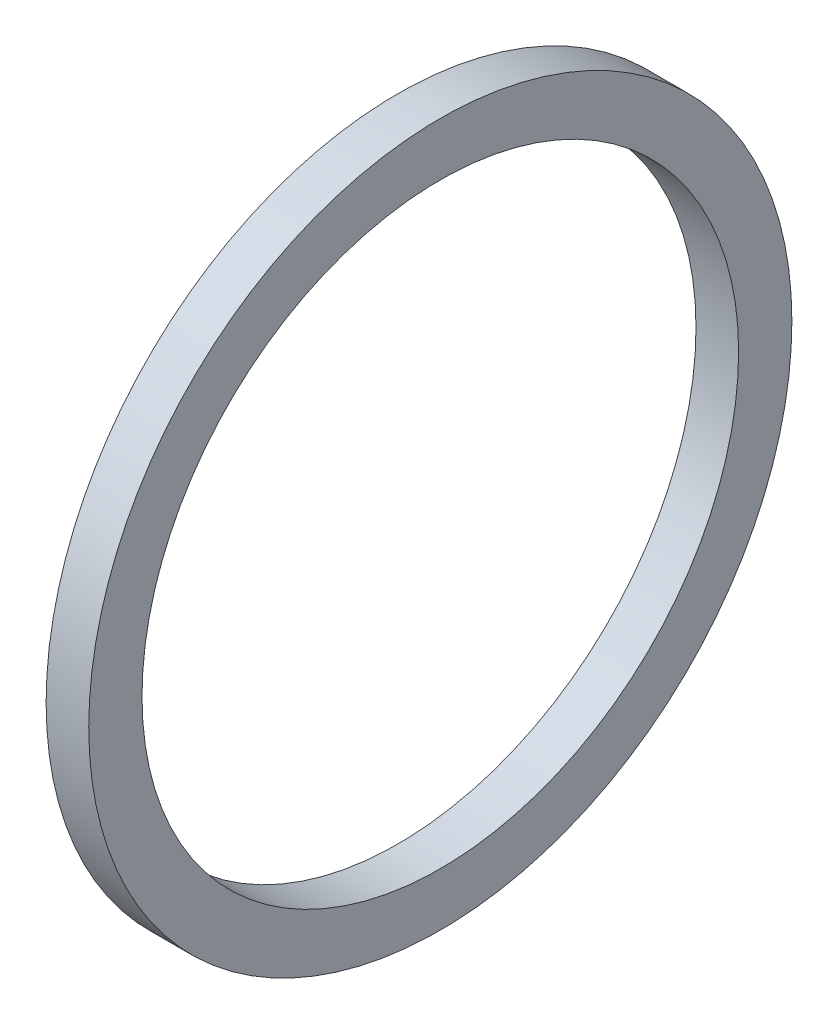
ISO-10303-21;
HEADER;
FILE_DESCRIPTION(('STEP AP214'),'2;1');
FILE_NAME('part.step','',(''),(''),'','','');
FILE_SCHEMA(('AUTOMOTIVE_DESIGN { 1 0 10303 214 1 1 1 1 }'));
ENDSEC;
DATA;
#1=APPLICATION_CONTEXT('core data for automotive mechanical design processes');
#2=APPLICATION_PROTOCOL_DEFINITION('international standard','automotive_design',2000,#1);
#3=PRODUCT_CONTEXT('',#1,'mechanical');
#4=PRODUCT('Part','Part','',(#3));
#5=PRODUCT_RELATED_PRODUCT_CATEGORY('part','',(#4));
#6=PRODUCT_DEFINITION_FORMATION('','',#4);
#7=PRODUCT_DEFINITION_CONTEXT('part definition',#1,'design');
#8=PRODUCT_DEFINITION('design','',#6,#7);
#9=PRODUCT_DEFINITION_SHAPE('','',#8);
#10=(LENGTH_UNIT() NAMED_UNIT(*) SI_UNIT(.MILLI.,.METRE.));
#11=(NAMED_UNIT(*) PLANE_ANGLE_UNIT() SI_UNIT($,.RADIAN.));
#12=(NAMED_UNIT(*) SI_UNIT($,.STERADIAN.) SOLID_ANGLE_UNIT());
#13=UNCERTAINTY_MEASURE_WITH_UNIT(LENGTH_MEASURE(1.E-05),#10,'distance_accuracy_value','');
#14=(GEOMETRIC_REPRESENTATION_CONTEXT(3) GLOBAL_UNCERTAINTY_ASSIGNED_CONTEXT((#13)) GLOBAL_UNIT_ASSIGNED_CONTEXT((#10,
#11,#12)) REPRESENTATION_CONTEXT('',''));
#15=CARTESIAN_POINT('',(0.,0.,0.));
#16=DIRECTION('',(0.,0.,1.));
#17=DIRECTION('',(1.,0.,0.));
#18=AXIS2_PLACEMENT_3D('',#15,#16,#17);
#19=CARTESIAN_POINT('',(-1.,16.5,0.));
#20=DIRECTION('',(1.,0.,0.));
#21=DIRECTION('',(0.,0.,-1.));
#22=AXIS2_PLACEMENT_3D('',#19,#20,#21);
#23=PLANE('',#22);
#24=CARTESIAN_POINT('',(-1.,0.,0.));
#25=DIRECTION('',(-1.,0.,0.));
#26=DIRECTION('',(0.,0.,1.));
#27=AXIS2_PLACEMENT_3D('',#24,#25,#26);
#28=CIRCLE('',#27,14.);
#29=CARTESIAN_POINT('',(-1.,0.,14.));
#30=VERTEX_POINT('',#29);
#31=EDGE_CURVE('E10',#30,#30,#28,.T.);
#32=ORIENTED_EDGE('',*,*,#31,.F.);
#33=EDGE_LOOP('',(#32));
#34=FACE_BOUND('',#33,.T.);
#35=CARTESIAN_POINT('',(-1.,0.,0.));
#36=DIRECTION('',(-1.,0.,0.));
#37=DIRECTION('',(0.,0.,1.));
#38=AXIS2_PLACEMENT_3D('',#35,#36,#37);
#39=CIRCLE('',#38,16.5);
#40=CARTESIAN_POINT('',(-1.,0.,16.5));
#41=VERTEX_POINT('',#40);
#42=EDGE_CURVE('E54',#41,#41,#39,.T.);
#43=ORIENTED_EDGE('',*,*,#42,.T.);
#44=EDGE_LOOP('',(#43));
#45=FACE_BOUND('',#44,.T.);
#46=ADVANCED_FACE('F37',(#34,#45),#23,.F.);
#47=CARTESIAN_POINT('',(-110.,0.,0.));
#48=DIRECTION('',(-1.,0.,0.));
#49=DIRECTION('',(0.,0.,1.));
#50=AXIS2_PLACEMENT_3D('',#47,#48,#49);
#51=CYLINDRICAL_SURFACE('',#50,14.);
#52=CARTESIAN_POINT('',(1.,0.,0.));
#53=DIRECTION('',(-1.,0.,0.));
#54=DIRECTION('',(0.,0.,1.));
#55=AXIS2_PLACEMENT_3D('',#52,#53,#54);
#56=CIRCLE('',#55,14.);
#57=CARTESIAN_POINT('',(1.,0.,14.));
#58=VERTEX_POINT('',#57);
#59=EDGE_CURVE('E44',#58,#58,#56,.T.);
#60=ORIENTED_EDGE('',*,*,#59,.F.);
#61=EDGE_LOOP('',(#60));
#62=FACE_BOUND('',#61,.T.);
#63=ORIENTED_EDGE('',*,*,#31,.T.);
#64=EDGE_LOOP('',(#63));
#65=FACE_BOUND('',#64,.T.);
#66=ADVANCED_FACE('F70',(#62,#65),#51,.F.);
#67=CARTESIAN_POINT('',(1.,14.,0.));
#68=DIRECTION('',(-1.,0.,0.));
#69=DIRECTION('',(0.,0.,1.));
#70=AXIS2_PLACEMENT_3D('',#67,#68,#69);
#71=PLANE('',#70);
#72=CARTESIAN_POINT('',(1.,0.,0.));
#73=DIRECTION('',(-1.,0.,0.));
#74=DIRECTION('',(0.,0.,1.));
#75=AXIS2_PLACEMENT_3D('',#72,#73,#74);
#76=CIRCLE('',#75,16.5);
#77=CARTESIAN_POINT('',(1.,0.,16.5));
#78=VERTEX_POINT('',#77);
#79=EDGE_CURVE('E49',#78,#78,#76,.T.);
#80=ORIENTED_EDGE('',*,*,#79,.F.);
#81=EDGE_LOOP('',(#80));
#82=FACE_BOUND('',#81,.T.);
#83=ORIENTED_EDGE('',*,*,#59,.T.);
#84=EDGE_LOOP('',(#83));
#85=FACE_BOUND('',#84,.T.);
#86=ADVANCED_FACE('F65',(#82,#85),#71,.F.);
#87=CARTESIAN_POINT('',(-110.,0.,0.));
#88=DIRECTION('',(-1.,0.,0.));
#89=DIRECTION('',(0.,0.,1.));
#90=AXIS2_PLACEMENT_3D('',#87,#88,#89);
#91=CYLINDRICAL_SURFACE('',#90,16.5);
#92=ORIENTED_EDGE('',*,*,#42,.F.);
#93=EDGE_LOOP('',(#92));
#94=FACE_BOUND('',#93,.T.);
#95=ORIENTED_EDGE('',*,*,#79,.T.);
#96=EDGE_LOOP('',(#95));
#97=FACE_BOUND('',#96,.T.);
#98=ADVANCED_FACE('F62',(#94,#97),#91,.T.);
#99=CLOSED_SHELL('',(#46,#66,#86,#98));
#100=MANIFOLD_SOLID_BREP('B2',#99);
#101=ADVANCED_BREP_SHAPE_REPRESENTATION('',(#18,#100),#14);
#102=SHAPE_DEFINITION_REPRESENTATION(#9,#101);
ENDSEC;
END-ISO-10303-21;
